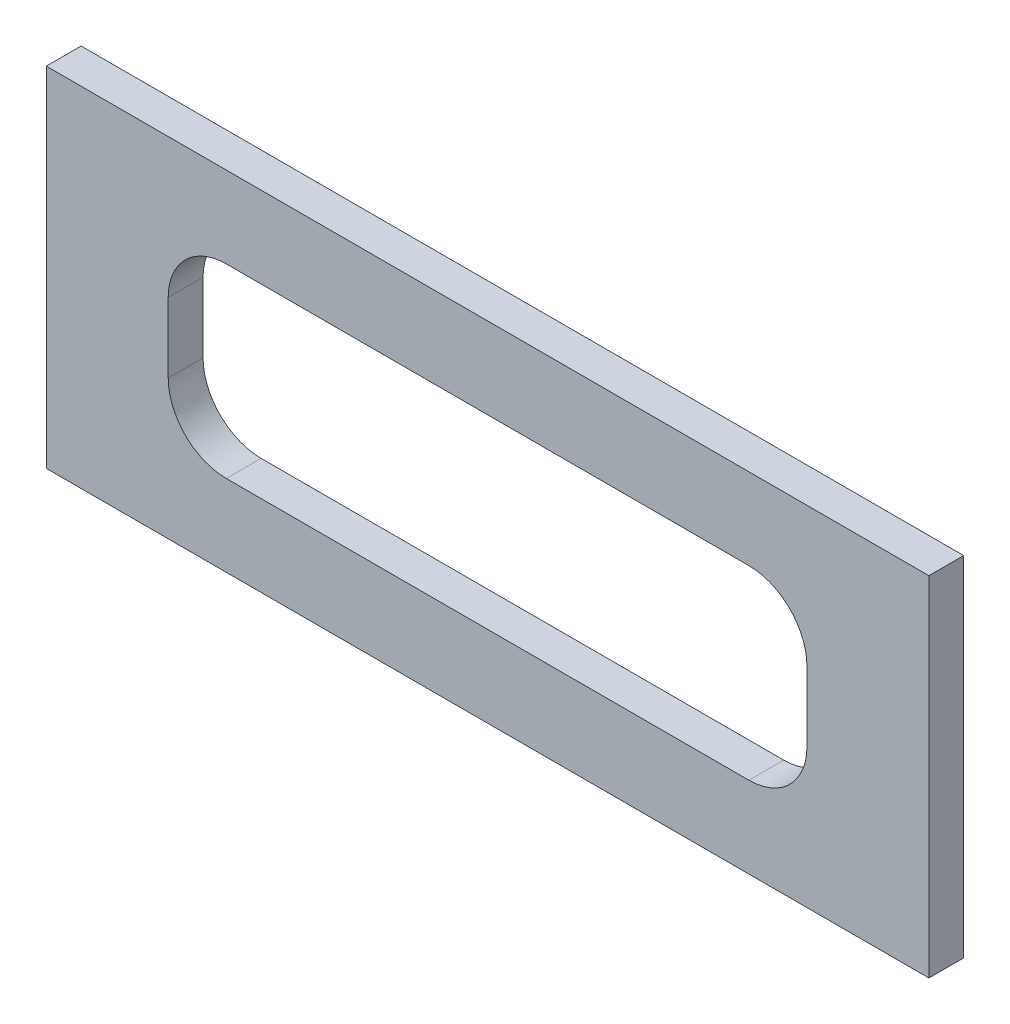
ISO-10303-21;
HEADER;
FILE_DESCRIPTION(('STEP AP214'),'2;1');
FILE_NAME('part.step','',(''),(''),'','','');
FILE_SCHEMA(('AUTOMOTIVE_DESIGN { 1 0 10303 214 1 1 1 1 }'));
ENDSEC;
DATA;
#1=APPLICATION_CONTEXT('core data for automotive mechanical design processes');
#2=APPLICATION_PROTOCOL_DEFINITION('international standard','automotive_design',2000,#1);
#3=PRODUCT_CONTEXT('',#1,'mechanical');
#4=PRODUCT('Part','Part','',(#3));
#5=PRODUCT_RELATED_PRODUCT_CATEGORY('part','',(#4));
#6=PRODUCT_DEFINITION_FORMATION('','',#4);
#7=PRODUCT_DEFINITION_CONTEXT('part definition',#1,'design');
#8=PRODUCT_DEFINITION('design','',#6,#7);
#9=PRODUCT_DEFINITION_SHAPE('','',#8);
#10=(LENGTH_UNIT() NAMED_UNIT(*) SI_UNIT(.MILLI.,.METRE.));
#11=(NAMED_UNIT(*) PLANE_ANGLE_UNIT() SI_UNIT($,.RADIAN.));
#12=(NAMED_UNIT(*) SI_UNIT($,.STERADIAN.) SOLID_ANGLE_UNIT());
#13=UNCERTAINTY_MEASURE_WITH_UNIT(LENGTH_MEASURE(1.E-05),#10,'distance_accuracy_value','');
#14=(GEOMETRIC_REPRESENTATION_CONTEXT(3) GLOBAL_UNCERTAINTY_ASSIGNED_CONTEXT((#13)) GLOBAL_UNIT_ASSIGNED_CONTEXT((#10,
#11,#12)) REPRESENTATION_CONTEXT('',''));
#15=CARTESIAN_POINT('',(0.,0.,0.));
#16=DIRECTION('',(0.,0.,1.));
#17=DIRECTION('',(1.,0.,0.));
#18=AXIS2_PLACEMENT_3D('',#15,#16,#17);
#19=CARTESIAN_POINT('',(0.,0.,6.));
#20=DIRECTION('',(0.,0.,1.));
#21=DIRECTION('',(1.,0.,0.));
#22=AXIS2_PLACEMENT_3D('',#19,#20,#21);
#23=PLANE('',#22);
#24=DIRECTION('',(0.,-1.,0.));
#25=VECTOR('',#24,1.);
#26=CARTESIAN_POINT('',(-76.,-30.,6.));
#27=LINE('',#26,#25);
#28=CARTESIAN_POINT('',(-76.,30.,6.));
#29=VERTEX_POINT('',#28);
#30=CARTESIAN_POINT('',(-76.,-30.,6.));
#31=VERTEX_POINT('',#30);
#32=EDGE_CURVE('E189',#29,#31,#27,.T.);
#33=ORIENTED_EDGE('',*,*,#32,.T.);
#34=DIRECTION('',(1.,0.,0.));
#35=VECTOR('',#34,1.);
#36=CARTESIAN_POINT('',(76.,-30.,6.));
#37=LINE('',#36,#35);
#38=CARTESIAN_POINT('',(76.,-30.,6.));
#39=VERTEX_POINT('',#38);
#40=EDGE_CURVE('E192',#31,#39,#37,.T.);
#41=ORIENTED_EDGE('',*,*,#40,.T.);
#42=DIRECTION('',(0.,1.,0.));
#43=VECTOR('',#42,1.);
#44=CARTESIAN_POINT('',(76.,-30.,6.));
#45=LINE('',#44,#43);
#46=CARTESIAN_POINT('',(76.,30.,6.));
#47=VERTEX_POINT('',#46);
#48=EDGE_CURVE('E195',#39,#47,#45,.T.);
#49=ORIENTED_EDGE('',*,*,#48,.T.);
#50=DIRECTION('',(-1.,0.,0.));
#51=VECTOR('',#50,1.);
#52=CARTESIAN_POINT('',(76.,30.,6.));
#53=LINE('',#52,#51);
#54=EDGE_CURVE('E197',#47,#29,#53,.T.);
#55=ORIENTED_EDGE('',*,*,#54,.T.);
#56=EDGE_LOOP('',(#33,#41,#49,#55));
#57=FACE_BOUND('',#56,.T.);
#58=DIRECTION('',(-1.,0.,0.));
#59=VECTOR('',#58,1.);
#60=CARTESIAN_POINT('',(45.,16.,6.));
#61=LINE('',#60,#59);
#62=CARTESIAN_POINT('',(45.,16.,6.));
#63=VERTEX_POINT('',#62);
#64=CARTESIAN_POINT('',(-45.,16.,6.));
#65=VERTEX_POINT('',#64);
#66=EDGE_CURVE('E132',#63,#65,#61,.T.);
#67=ORIENTED_EDGE('',*,*,#66,.F.);
#68=CARTESIAN_POINT('',(45.,6.,6.));
#69=DIRECTION('',(0.,0.,1.));
#70=DIRECTION('',(1.,0.,0.));
#71=AXIS2_PLACEMENT_3D('',#68,#69,#70);
#72=CIRCLE('',#71,10.);
#73=CARTESIAN_POINT('',(55.,6.,6.));
#74=VERTEX_POINT('',#73);
#75=EDGE_CURVE('E124',#74,#63,#72,.T.);
#76=ORIENTED_EDGE('',*,*,#75,.F.);
#77=DIRECTION('',(0.,1.,0.));
#78=VECTOR('',#77,1.);
#79=CARTESIAN_POINT('',(55.,-6.,6.));
#80=LINE('',#79,#78);
#81=CARTESIAN_POINT('',(55.,-6.,6.));
#82=VERTEX_POINT('',#81);
#83=EDGE_CURVE('E157',#82,#74,#80,.T.);
#84=ORIENTED_EDGE('',*,*,#83,.F.);
#85=CARTESIAN_POINT('',(45.,-6.,6.));
#86=DIRECTION('',(0.,0.,1.));
#87=DIRECTION('',(1.,0.,0.));
#88=AXIS2_PLACEMENT_3D('',#85,#86,#87);
#89=CIRCLE('',#88,10.);
#90=CARTESIAN_POINT('',(45.,-16.,6.));
#91=VERTEX_POINT('',#90);
#92=EDGE_CURVE('E155',#91,#82,#89,.T.);
#93=ORIENTED_EDGE('',*,*,#92,.F.);
#94=DIRECTION('',(1.,0.,0.));
#95=VECTOR('',#94,1.);
#96=CARTESIAN_POINT('',(45.,-16.,6.));
#97=LINE('',#96,#95);
#98=CARTESIAN_POINT('',(-45.,-16.,6.));
#99=VERTEX_POINT('',#98);
#100=EDGE_CURVE('E153',#99,#91,#97,.T.);
#101=ORIENTED_EDGE('',*,*,#100,.F.);
#102=CARTESIAN_POINT('',(-45.,-6.00000000000001,6.));
#103=DIRECTION('',(0.,0.,1.));
#104=DIRECTION('',(-1.,0.,0.));
#105=AXIS2_PLACEMENT_3D('',#102,#103,#104);
#106=CIRCLE('',#105,10.);
#107=CARTESIAN_POINT('',(-55.,-6.00000000000001,6.));
#108=VERTEX_POINT('',#107);
#109=EDGE_CURVE('E151',#108,#99,#106,.T.);
#110=ORIENTED_EDGE('',*,*,#109,.F.);
#111=DIRECTION('',(0.,-1.,0.));
#112=VECTOR('',#111,1.);
#113=CARTESIAN_POINT('',(-55.,-6.00000000000001,6.));
#114=LINE('',#113,#112);
#115=CARTESIAN_POINT('',(-55.,5.99999999999999,6.));
#116=VERTEX_POINT('',#115);
#117=EDGE_CURVE('E147',#116,#108,#114,.T.);
#118=ORIENTED_EDGE('',*,*,#117,.F.);
#119=CARTESIAN_POINT('',(-45.,5.99999999999999,6.));
#120=DIRECTION('',(0.,0.,1.));
#121=DIRECTION('',(1.,0.,0.));
#122=AXIS2_PLACEMENT_3D('',#119,#120,#121);
#123=CIRCLE('',#122,10.);
#124=EDGE_CURVE('E145',#65,#116,#123,.T.);
#125=ORIENTED_EDGE('',*,*,#124,.F.);
#126=EDGE_LOOP('',(#67,#76,#84,#93,#101,#110,#118,#125));
#127=FACE_BOUND('',#126,.T.);
#128=ADVANCED_FACE('F35',(#57,#127),#23,.T.);
#129=CARTESIAN_POINT('',(0.,0.,0.));
#130=DIRECTION('',(0.,0.,1.));
#131=DIRECTION('',(1.,0.,0.));
#132=AXIS2_PLACEMENT_3D('',#129,#130,#131);
#133=PLANE('',#132);
#134=DIRECTION('',(0.,-1.,0.));
#135=VECTOR('',#134,1.);
#136=CARTESIAN_POINT('',(-76.,-30.,0.));
#137=LINE('',#136,#135);
#138=CARTESIAN_POINT('',(-76.,30.,0.));
#139=VERTEX_POINT('',#138);
#140=CARTESIAN_POINT('',(-76.,-30.,0.));
#141=VERTEX_POINT('',#140);
#142=EDGE_CURVE('E140',#139,#141,#137,.T.);
#143=ORIENTED_EDGE('',*,*,#142,.F.);
#144=DIRECTION('',(-1.,0.,0.));
#145=VECTOR('',#144,1.);
#146=CARTESIAN_POINT('',(76.,30.,0.));
#147=LINE('',#146,#145);
#148=CARTESIAN_POINT('',(76.,30.,0.));
#149=VERTEX_POINT('',#148);
#150=EDGE_CURVE('E193',#149,#139,#147,.T.);
#151=ORIENTED_EDGE('',*,*,#150,.F.);
#152=DIRECTION('',(0.,1.,0.));
#153=VECTOR('',#152,1.);
#154=CARTESIAN_POINT('',(76.,-30.,0.));
#155=LINE('',#154,#153);
#156=CARTESIAN_POINT('',(76.,-30.,0.));
#157=VERTEX_POINT('',#156);
#158=EDGE_CURVE('E204',#157,#149,#155,.T.);
#159=ORIENTED_EDGE('',*,*,#158,.F.);
#160=DIRECTION('',(1.,0.,0.));
#161=VECTOR('',#160,1.);
#162=CARTESIAN_POINT('',(76.,-30.,0.));
#163=LINE('',#162,#161);
#164=EDGE_CURVE('E202',#141,#157,#163,.T.);
#165=ORIENTED_EDGE('',*,*,#164,.F.);
#166=EDGE_LOOP('',(#143,#151,#159,#165));
#167=FACE_BOUND('',#166,.T.);
#168=CARTESIAN_POINT('',(45.,6.,0.));
#169=DIRECTION('',(0.,0.,1.));
#170=DIRECTION('',(1.,0.,0.));
#171=AXIS2_PLACEMENT_3D('',#168,#169,#170);
#172=CIRCLE('',#171,10.);
#173=CARTESIAN_POINT('',(55.,6.,0.));
#174=VERTEX_POINT('',#173);
#175=CARTESIAN_POINT('',(45.,16.,0.));
#176=VERTEX_POINT('',#175);
#177=EDGE_CURVE('E58',#174,#176,#172,.T.);
#178=ORIENTED_EDGE('',*,*,#177,.T.);
#179=DIRECTION('',(-1.,0.,0.));
#180=VECTOR('',#179,1.);
#181=CARTESIAN_POINT('',(45.,16.,0.));
#182=LINE('',#181,#180);
#183=CARTESIAN_POINT('',(-45.,16.,0.));
#184=VERTEX_POINT('',#183);
#185=EDGE_CURVE('E139',#176,#184,#182,.T.);
#186=ORIENTED_EDGE('',*,*,#185,.T.);
#187=CARTESIAN_POINT('',(-45.,5.99999999999999,0.));
#188=DIRECTION('',(0.,0.,1.));
#189=DIRECTION('',(1.,0.,0.));
#190=AXIS2_PLACEMENT_3D('',#187,#188,#189);
#191=CIRCLE('',#190,10.);
#192=CARTESIAN_POINT('',(-55.,5.99999999999999,0.));
#193=VERTEX_POINT('',#192);
#194=EDGE_CURVE('E161',#184,#193,#191,.T.);
#195=ORIENTED_EDGE('',*,*,#194,.T.);
#196=DIRECTION('',(0.,-1.,0.));
#197=VECTOR('',#196,1.);
#198=CARTESIAN_POINT('',(-55.,-6.00000000000001,0.));
#199=LINE('',#198,#197);
#200=CARTESIAN_POINT('',(-55.,-6.00000000000001,0.));
#201=VERTEX_POINT('',#200);
#202=EDGE_CURVE('E164',#193,#201,#199,.T.);
#203=ORIENTED_EDGE('',*,*,#202,.T.);
#204=CARTESIAN_POINT('',(-45.,-6.00000000000001,0.));
#205=DIRECTION('',(0.,0.,1.));
#206=DIRECTION('',(-1.,0.,0.));
#207=AXIS2_PLACEMENT_3D('',#204,#205,#206);
#208=CIRCLE('',#207,10.);
#209=CARTESIAN_POINT('',(-45.,-16.,0.));
#210=VERTEX_POINT('',#209);
#211=EDGE_CURVE('E167',#201,#210,#208,.T.);
#212=ORIENTED_EDGE('',*,*,#211,.T.);
#213=DIRECTION('',(1.,0.,0.));
#214=VECTOR('',#213,1.);
#215=CARTESIAN_POINT('',(45.,-16.,0.));
#216=LINE('',#215,#214);
#217=CARTESIAN_POINT('',(45.,-16.,0.));
#218=VERTEX_POINT('',#217);
#219=EDGE_CURVE('E170',#210,#218,#216,.T.);
#220=ORIENTED_EDGE('',*,*,#219,.T.);
#221=CARTESIAN_POINT('',(45.,-6.,0.));
#222=DIRECTION('',(0.,0.,1.));
#223=DIRECTION('',(1.,0.,0.));
#224=AXIS2_PLACEMENT_3D('',#221,#222,#223);
#225=CIRCLE('',#224,10.);
#226=CARTESIAN_POINT('',(55.,-6.,0.));
#227=VERTEX_POINT('',#226);
#228=EDGE_CURVE('E173',#218,#227,#225,.T.);
#229=ORIENTED_EDGE('',*,*,#228,.T.);
#230=DIRECTION('',(0.,1.,0.));
#231=VECTOR('',#230,1.);
#232=CARTESIAN_POINT('',(55.,-6.,0.));
#233=LINE('',#232,#231);
#234=EDGE_CURVE('E133',#227,#174,#233,.T.);
#235=ORIENTED_EDGE('',*,*,#234,.T.);
#236=EDGE_LOOP('',(#178,#186,#195,#203,#212,#220,#229,#235));
#237=FACE_BOUND('',#236,.T.);
#238=ADVANCED_FACE('F222',(#167,#237),#133,.F.);
#239=CARTESIAN_POINT('',(-76.,-30.,6.));
#240=DIRECTION('',(1.,0.,0.));
#241=DIRECTION('',(0.,0.,-1.));
#242=AXIS2_PLACEMENT_3D('',#239,#240,#241);
#243=PLANE('',#242);
#244=ORIENTED_EDGE('',*,*,#142,.T.);
#245=DIRECTION('',(0.,0.,-1.));
#246=VECTOR('',#245,1.);
#247=CARTESIAN_POINT('',(-76.,-30.,6.));
#248=LINE('',#247,#246);
#249=EDGE_CURVE('E11',#31,#141,#248,.T.);
#250=ORIENTED_EDGE('',*,*,#249,.F.);
#251=ORIENTED_EDGE('',*,*,#32,.F.);
#252=DIRECTION('',(0.,0.,-1.));
#253=VECTOR('',#252,1.);
#254=CARTESIAN_POINT('',(-76.,30.,6.));
#255=LINE('',#254,#253);
#256=EDGE_CURVE('E199',#29,#139,#255,.T.);
#257=ORIENTED_EDGE('',*,*,#256,.T.);
#258=EDGE_LOOP('',(#244,#250,#251,#257));
#259=FACE_BOUND('',#258,.T.);
#260=ADVANCED_FACE('F37',(#259),#243,.F.);
#261=CARTESIAN_POINT('',(76.,-30.,6.));
#262=DIRECTION('',(0.,1.,0.));
#263=DIRECTION('',(-1.,0.,0.));
#264=AXIS2_PLACEMENT_3D('',#261,#262,#263);
#265=PLANE('',#264);
#266=ORIENTED_EDGE('',*,*,#164,.T.);
#267=DIRECTION('',(0.,0.,-1.));
#268=VECTOR('',#267,1.);
#269=CARTESIAN_POINT('',(76.,-30.,6.));
#270=LINE('',#269,#268);
#271=EDGE_CURVE('E43',#39,#157,#270,.T.);
#272=ORIENTED_EDGE('',*,*,#271,.F.);
#273=ORIENTED_EDGE('',*,*,#40,.F.);
#274=ORIENTED_EDGE('',*,*,#249,.T.);
#275=EDGE_LOOP('',(#266,#272,#273,#274));
#276=FACE_BOUND('',#275,.T.);
#277=ADVANCED_FACE('F232',(#276),#265,.F.);
#278=CARTESIAN_POINT('',(76.,-30.,6.));
#279=DIRECTION('',(-1.,0.,0.));
#280=DIRECTION('',(0.,0.,1.));
#281=AXIS2_PLACEMENT_3D('',#278,#279,#280);
#282=PLANE('',#281);
#283=ORIENTED_EDGE('',*,*,#158,.T.);
#284=DIRECTION('',(0.,0.,-1.));
#285=VECTOR('',#284,1.);
#286=CARTESIAN_POINT('',(76.,30.,6.));
#287=LINE('',#286,#285);
#288=EDGE_CURVE('E209',#47,#149,#287,.T.);
#289=ORIENTED_EDGE('',*,*,#288,.F.);
#290=ORIENTED_EDGE('',*,*,#48,.F.);
#291=ORIENTED_EDGE('',*,*,#271,.T.);
#292=EDGE_LOOP('',(#283,#289,#290,#291));
#293=FACE_BOUND('',#292,.T.);
#294=ADVANCED_FACE('F216',(#293),#282,.F.);
#295=CARTESIAN_POINT('',(76.,30.,6.));
#296=DIRECTION('',(0.,-1.,0.));
#297=DIRECTION('',(1.,0.,0.));
#298=AXIS2_PLACEMENT_3D('',#295,#296,#297);
#299=PLANE('',#298);
#300=ORIENTED_EDGE('',*,*,#150,.T.);
#301=ORIENTED_EDGE('',*,*,#256,.F.);
#302=ORIENTED_EDGE('',*,*,#54,.F.);
#303=ORIENTED_EDGE('',*,*,#288,.T.);
#304=EDGE_LOOP('',(#300,#301,#302,#303));
#305=FACE_BOUND('',#304,.T.);
#306=ADVANCED_FACE('F226',(#305),#299,.F.);
#307=CARTESIAN_POINT('',(45.,6.,6.));
#308=DIRECTION('',(0.,0.,-1.));
#309=DIRECTION('',(-1.,0.,0.));
#310=AXIS2_PLACEMENT_3D('',#307,#308,#309);
#311=CYLINDRICAL_SURFACE('',#310,10.);
#312=ORIENTED_EDGE('',*,*,#177,.F.);
#313=DIRECTION('',(0.,0.,-1.));
#314=VECTOR('',#313,1.);
#315=CARTESIAN_POINT('',(55.,6.,6.));
#316=LINE('',#315,#314);
#317=EDGE_CURVE('E128',#74,#174,#316,.T.);
#318=ORIENTED_EDGE('',*,*,#317,.F.);
#319=ORIENTED_EDGE('',*,*,#75,.T.);
#320=DIRECTION('',(0.,0.,-1.));
#321=VECTOR('',#320,1.);
#322=CARTESIAN_POINT('',(45.,16.,6.));
#323=LINE('',#322,#321);
#324=EDGE_CURVE('E127',#63,#176,#323,.T.);
#325=ORIENTED_EDGE('',*,*,#324,.T.);
#326=EDGE_LOOP('',(#312,#318,#319,#325));
#327=FACE_BOUND('',#326,.T.);
#328=ADVANCED_FACE('F126',(#327),#311,.F.);
#329=CARTESIAN_POINT('',(45.,16.,6.));
#330=DIRECTION('',(0.,-1.,0.));
#331=DIRECTION('',(1.,0.,0.));
#332=AXIS2_PLACEMENT_3D('',#329,#330,#331);
#333=PLANE('',#332);
#334=ORIENTED_EDGE('',*,*,#185,.F.);
#335=ORIENTED_EDGE('',*,*,#324,.F.);
#336=ORIENTED_EDGE('',*,*,#66,.T.);
#337=DIRECTION('',(0.,0.,-1.));
#338=VECTOR('',#337,1.);
#339=CARTESIAN_POINT('',(-45.,16.,6.));
#340=LINE('',#339,#338);
#341=EDGE_CURVE('E141',#65,#184,#340,.T.);
#342=ORIENTED_EDGE('',*,*,#341,.T.);
#343=EDGE_LOOP('',(#334,#335,#336,#342));
#344=FACE_BOUND('',#343,.T.);
#345=ADVANCED_FACE('F136',(#344),#333,.T.);
#346=CARTESIAN_POINT('',(-45.,5.99999999999999,6.));
#347=DIRECTION('',(0.,0.,-1.));
#348=DIRECTION('',(-1.,0.,0.));
#349=AXIS2_PLACEMENT_3D('',#346,#347,#348);
#350=CYLINDRICAL_SURFACE('',#349,10.);
#351=ORIENTED_EDGE('',*,*,#194,.F.);
#352=ORIENTED_EDGE('',*,*,#341,.F.);
#353=ORIENTED_EDGE('',*,*,#124,.T.);
#354=DIRECTION('',(0.,0.,-1.));
#355=VECTOR('',#354,1.);
#356=CARTESIAN_POINT('',(-55.,5.99999999999999,6.));
#357=LINE('',#356,#355);
#358=EDGE_CURVE('E186',#116,#193,#357,.T.);
#359=ORIENTED_EDGE('',*,*,#358,.T.);
#360=EDGE_LOOP('',(#351,#352,#353,#359));
#361=FACE_BOUND('',#360,.T.);
#362=ADVANCED_FACE('F255',(#361),#350,.F.);
#363=CARTESIAN_POINT('',(-55.,-6.00000000000001,6.));
#364=DIRECTION('',(1.,0.,0.));
#365=DIRECTION('',(0.,0.,-1.));
#366=AXIS2_PLACEMENT_3D('',#363,#364,#365);
#367=PLANE('',#366);
#368=ORIENTED_EDGE('',*,*,#202,.F.);
#369=ORIENTED_EDGE('',*,*,#358,.F.);
#370=ORIENTED_EDGE('',*,*,#117,.T.);
#371=DIRECTION('',(0.,0.,-1.));
#372=VECTOR('',#371,1.);
#373=CARTESIAN_POINT('',(-55.,-6.00000000000001,6.));
#374=LINE('',#373,#372);
#375=EDGE_CURVE('E184',#108,#201,#374,.T.);
#376=ORIENTED_EDGE('',*,*,#375,.T.);
#377=EDGE_LOOP('',(#368,#369,#370,#376));
#378=FACE_BOUND('',#377,.T.);
#379=ADVANCED_FACE('F259',(#378),#367,.T.);
#380=CARTESIAN_POINT('',(-45.,-6.00000000000001,6.));
#381=DIRECTION('',(0.,0.,-1.));
#382=DIRECTION('',(-1.,0.,0.));
#383=AXIS2_PLACEMENT_3D('',#380,#381,#382);
#384=CYLINDRICAL_SURFACE('',#383,10.);
#385=ORIENTED_EDGE('',*,*,#211,.F.);
#386=ORIENTED_EDGE('',*,*,#375,.F.);
#387=ORIENTED_EDGE('',*,*,#109,.T.);
#388=DIRECTION('',(0.,0.,-1.));
#389=VECTOR('',#388,1.);
#390=CARTESIAN_POINT('',(-45.,-16.,6.));
#391=LINE('',#390,#389);
#392=EDGE_CURVE('E182',#99,#210,#391,.T.);
#393=ORIENTED_EDGE('',*,*,#392,.T.);
#394=EDGE_LOOP('',(#385,#386,#387,#393));
#395=FACE_BOUND('',#394,.T.);
#396=ADVANCED_FACE('F265',(#395),#384,.F.);
#397=CARTESIAN_POINT('',(45.,-16.,6.));
#398=DIRECTION('',(0.,1.,0.));
#399=DIRECTION('',(-1.,0.,0.));
#400=AXIS2_PLACEMENT_3D('',#397,#398,#399);
#401=PLANE('',#400);
#402=ORIENTED_EDGE('',*,*,#219,.F.);
#403=ORIENTED_EDGE('',*,*,#392,.F.);
#404=ORIENTED_EDGE('',*,*,#100,.T.);
#405=DIRECTION('',(0.,0.,-1.));
#406=VECTOR('',#405,1.);
#407=CARTESIAN_POINT('',(45.,-16.,6.));
#408=LINE('',#407,#406);
#409=EDGE_CURVE('E180',#91,#218,#408,.T.);
#410=ORIENTED_EDGE('',*,*,#409,.T.);
#411=EDGE_LOOP('',(#402,#403,#404,#410));
#412=FACE_BOUND('',#411,.T.);
#413=ADVANCED_FACE('F269',(#412),#401,.T.);
#414=CARTESIAN_POINT('',(45.,-6.,6.));
#415=DIRECTION('',(0.,0.,-1.));
#416=DIRECTION('',(-1.,0.,0.));
#417=AXIS2_PLACEMENT_3D('',#414,#415,#416);
#418=CYLINDRICAL_SURFACE('',#417,10.);
#419=ORIENTED_EDGE('',*,*,#228,.F.);
#420=ORIENTED_EDGE('',*,*,#409,.F.);
#421=ORIENTED_EDGE('',*,*,#92,.T.);
#422=DIRECTION('',(0.,0.,-1.));
#423=VECTOR('',#422,1.);
#424=CARTESIAN_POINT('',(55.,-6.,6.));
#425=LINE('',#424,#423);
#426=EDGE_CURVE('E50',#82,#227,#425,.T.);
#427=ORIENTED_EDGE('',*,*,#426,.T.);
#428=EDGE_LOOP('',(#419,#420,#421,#427));
#429=FACE_BOUND('',#428,.T.);
#430=ADVANCED_FACE('F273',(#429),#418,.F.);
#431=CARTESIAN_POINT('',(55.,-6.,6.));
#432=DIRECTION('',(-1.,0.,0.));
#433=DIRECTION('',(0.,-1.,0.));
#434=AXIS2_PLACEMENT_3D('',#431,#432,#433);
#435=PLANE('',#434);
#436=ORIENTED_EDGE('',*,*,#234,.F.);
#437=ORIENTED_EDGE('',*,*,#426,.F.);
#438=ORIENTED_EDGE('',*,*,#83,.T.);
#439=ORIENTED_EDGE('',*,*,#317,.T.);
#440=EDGE_LOOP('',(#436,#437,#438,#439));
#441=FACE_BOUND('',#440,.T.);
#442=ADVANCED_FACE('F277',(#441),#435,.T.);
#443=CLOSED_SHELL('',(#128,#238,#260,#277,#294,#306,#328,#345,#362,#379,#396,#413,#430,#442));
#444=MANIFOLD_SOLID_BREP('B2',#443);
#445=ADVANCED_BREP_SHAPE_REPRESENTATION('',(#18,#444),#14);
#446=SHAPE_DEFINITION_REPRESENTATION(#9,#445);
ENDSEC;
END-ISO-10303-21;
